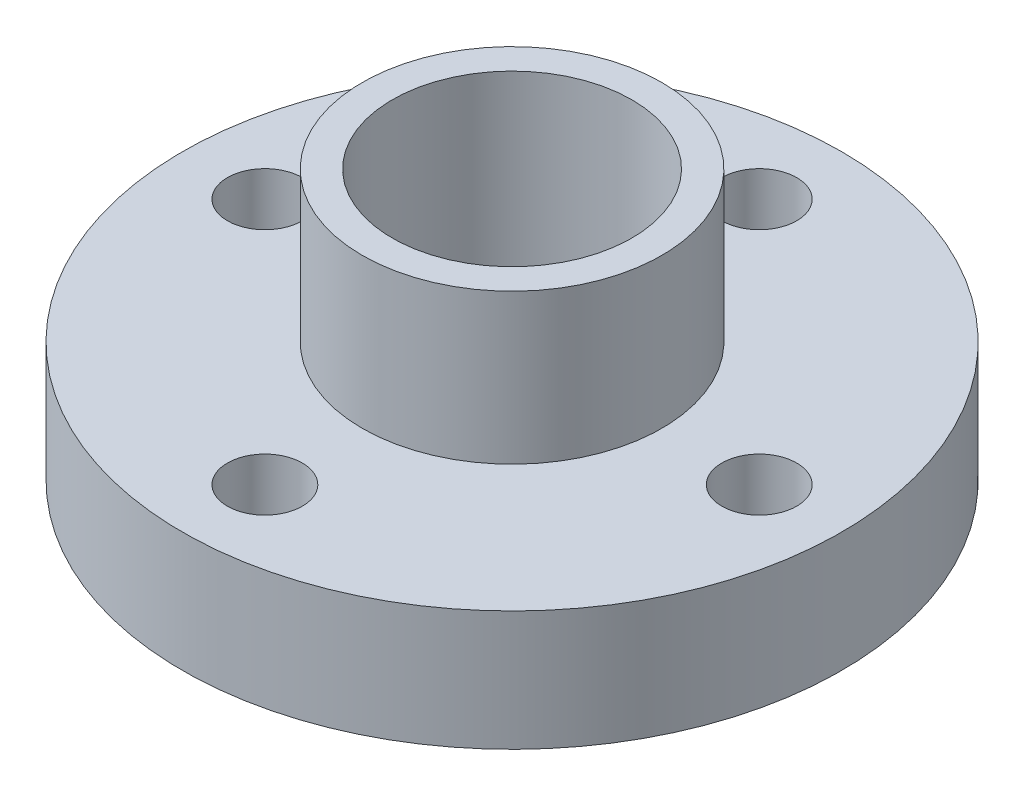
ISO-10303-21;
HEADER;
FILE_DESCRIPTION(('STEP AP214'),'2;1');
FILE_NAME('part.step','',(''),(''),'','','');
FILE_SCHEMA(('AUTOMOTIVE_DESIGN { 1 0 10303 214 1 1 1 1 }'));
ENDSEC;
DATA;
#1=APPLICATION_CONTEXT('core data for automotive mechanical design processes');
#2=APPLICATION_PROTOCOL_DEFINITION('international standard','automotive_design',2000,#1);
#3=PRODUCT_CONTEXT('',#1,'mechanical');
#4=PRODUCT('Part','Part','',(#3));
#5=PRODUCT_RELATED_PRODUCT_CATEGORY('part','',(#4));
#6=PRODUCT_DEFINITION_FORMATION('','',#4);
#7=PRODUCT_DEFINITION_CONTEXT('part definition',#1,'design');
#8=PRODUCT_DEFINITION('design','',#6,#7);
#9=PRODUCT_DEFINITION_SHAPE('','',#8);
#10=(LENGTH_UNIT() NAMED_UNIT(*) SI_UNIT(.MILLI.,.METRE.));
#11=(NAMED_UNIT(*) PLANE_ANGLE_UNIT() SI_UNIT($,.RADIAN.));
#12=(NAMED_UNIT(*) SI_UNIT($,.STERADIAN.) SOLID_ANGLE_UNIT());
#13=UNCERTAINTY_MEASURE_WITH_UNIT(LENGTH_MEASURE(1.E-05),#10,'distance_accuracy_value','');
#14=(GEOMETRIC_REPRESENTATION_CONTEXT(3) GLOBAL_UNCERTAINTY_ASSIGNED_CONTEXT((#13)) GLOBAL_UNIT_ASSIGNED_CONTEXT((#10,
#11,#12)) REPRESENTATION_CONTEXT('',''));
#15=CARTESIAN_POINT('',(0.,0.,0.));
#16=DIRECTION('',(0.,0.,1.));
#17=DIRECTION('',(1.,0.,0.));
#18=AXIS2_PLACEMENT_3D('',#15,#16,#17);
#19=CARTESIAN_POINT('',(5.,0.,0.));
#20=DIRECTION('',(0.,-1.,0.));
#21=DIRECTION('',(0.,0.,-1.));
#22=AXIS2_PLACEMENT_3D('',#19,#20,#21);
#23=PLANE('',#22);
#24=CARTESIAN_POINT('',(0.,0.,-8.25));
#25=DIRECTION('',(0.,-1.,0.));
#26=DIRECTION('',(0.,0.,-1.));
#27=AXIS2_PLACEMENT_3D('',#24,#25,#26);
#28=CIRCLE('',#27,1.25);
#29=CARTESIAN_POINT('',(0.,0.,-9.5));
#30=VERTEX_POINT('',#29);
#31=EDGE_CURVE('E80',#30,#30,#28,.T.);
#32=ORIENTED_EDGE('',*,*,#31,.F.);
#33=EDGE_LOOP('',(#32));
#34=FACE_BOUND('',#33,.T.);
#35=CARTESIAN_POINT('',(8.25,0.,0.));
#36=DIRECTION('',(0.,-1.,0.));
#37=DIRECTION('',(0.,0.,-1.));
#38=AXIS2_PLACEMENT_3D('',#35,#36,#37);
#39=CIRCLE('',#38,1.25);
#40=CARTESIAN_POINT('',(8.25,0.,-1.25));
#41=VERTEX_POINT('',#40);
#42=EDGE_CURVE('E74',#41,#41,#39,.T.);
#43=ORIENTED_EDGE('',*,*,#42,.F.);
#44=EDGE_LOOP('',(#43));
#45=FACE_BOUND('',#44,.T.);
#46=CARTESIAN_POINT('',(0.,0.,8.25));
#47=DIRECTION('',(0.,-1.,0.));
#48=DIRECTION('',(0.,0.,-1.));
#49=AXIS2_PLACEMENT_3D('',#46,#47,#48);
#50=CIRCLE('',#49,1.25);
#51=CARTESIAN_POINT('',(0.,0.,7.));
#52=VERTEX_POINT('',#51);
#53=EDGE_CURVE('E68',#52,#52,#50,.T.);
#54=ORIENTED_EDGE('',*,*,#53,.F.);
#55=EDGE_LOOP('',(#54));
#56=FACE_BOUND('',#55,.T.);
#57=CARTESIAN_POINT('',(-8.25,0.,0.));
#58=DIRECTION('',(0.,-1.,0.));
#59=DIRECTION('',(0.,0.,-1.));
#60=AXIS2_PLACEMENT_3D('',#57,#58,#59);
#61=CIRCLE('',#60,1.25);
#62=CARTESIAN_POINT('',(-8.25,0.,-1.25));
#63=VERTEX_POINT('',#62);
#64=EDGE_CURVE('E62',#63,#63,#61,.T.);
#65=ORIENTED_EDGE('',*,*,#64,.F.);
#66=EDGE_LOOP('',(#65));
#67=FACE_BOUND('',#66,.T.);
#68=CARTESIAN_POINT('',(0.,0.,0.));
#69=DIRECTION('',(0.,-1.,0.));
#70=DIRECTION('',(0.,0.,-1.));
#71=AXIS2_PLACEMENT_3D('',#68,#69,#70);
#72=CIRCLE('',#71,11.);
#73=CARTESIAN_POINT('',(0.,0.,-11.));
#74=VERTEX_POINT('',#73);
#75=EDGE_CURVE('E10',#74,#74,#72,.T.);
#76=ORIENTED_EDGE('',*,*,#75,.T.);
#77=EDGE_LOOP('',(#76));
#78=FACE_BOUND('',#77,.T.);
#79=CARTESIAN_POINT('',(0.,0.,0.));
#80=DIRECTION('',(0.,-1.,0.));
#81=DIRECTION('',(0.,0.,-1.));
#82=AXIS2_PLACEMENT_3D('',#79,#80,#81);
#83=CIRCLE('',#82,5.);
#84=CARTESIAN_POINT('',(0.,0.,-5.));
#85=VERTEX_POINT('',#84);
#86=EDGE_CURVE('E59',#85,#85,#83,.T.);
#87=ORIENTED_EDGE('',*,*,#86,.F.);
#88=EDGE_LOOP('',(#87));
#89=FACE_BOUND('',#88,.T.);
#90=ADVANCED_FACE('F31',(#34,#45,#56,#67,#78,#89),#23,.T.);
#91=CARTESIAN_POINT('',(0.,0.,0.));
#92=DIRECTION('',(0.,-1.,0.));
#93=DIRECTION('',(0.,0.,-1.));
#94=AXIS2_PLACEMENT_3D('',#91,#92,#93);
#95=CYLINDRICAL_SURFACE('',#94,11.);
#96=CARTESIAN_POINT('',(0.,4.,0.));
#97=DIRECTION('',(0.,-1.,0.));
#98=DIRECTION('',(0.,0.,-1.));
#99=AXIS2_PLACEMENT_3D('',#96,#97,#98);
#100=CIRCLE('',#99,11.);
#101=CARTESIAN_POINT('',(0.,4.,-11.));
#102=VERTEX_POINT('',#101);
#103=EDGE_CURVE('E37',#102,#102,#100,.T.);
#104=ORIENTED_EDGE('',*,*,#103,.T.);
#105=EDGE_LOOP('',(#104));
#106=FACE_BOUND('',#105,.T.);
#107=ORIENTED_EDGE('',*,*,#75,.F.);
#108=EDGE_LOOP('',(#107));
#109=FACE_BOUND('',#108,.T.);
#110=ADVANCED_FACE('F93',(#106,#109),#95,.T.);
#111=CARTESIAN_POINT('',(11.,4.,0.));
#112=DIRECTION('',(0.,1.,0.));
#113=DIRECTION('',(0.,0.,1.));
#114=AXIS2_PLACEMENT_3D('',#111,#112,#113);
#115=PLANE('',#114);
#116=CARTESIAN_POINT('',(0.,4.,-8.25));
#117=DIRECTION('',(0.,1.,0.));
#118=DIRECTION('',(0.,0.,1.));
#119=AXIS2_PLACEMENT_3D('',#116,#117,#118);
#120=CIRCLE('',#119,1.25);
#121=CARTESIAN_POINT('',(0.,4.,-7.));
#122=VERTEX_POINT('',#121);
#123=EDGE_CURVE('E83',#122,#122,#120,.T.);
#124=ORIENTED_EDGE('',*,*,#123,.F.);
#125=EDGE_LOOP('',(#124));
#126=FACE_BOUND('',#125,.T.);
#127=CARTESIAN_POINT('',(8.25,4.,0.));
#128=DIRECTION('',(0.,1.,0.));
#129=DIRECTION('',(0.,0.,1.));
#130=AXIS2_PLACEMENT_3D('',#127,#128,#129);
#131=CIRCLE('',#130,1.25);
#132=CARTESIAN_POINT('',(8.25,4.,1.25));
#133=VERTEX_POINT('',#132);
#134=EDGE_CURVE('E77',#133,#133,#131,.T.);
#135=ORIENTED_EDGE('',*,*,#134,.F.);
#136=EDGE_LOOP('',(#135));
#137=FACE_BOUND('',#136,.T.);
#138=CARTESIAN_POINT('',(0.,4.,8.25));
#139=DIRECTION('',(0.,1.,0.));
#140=DIRECTION('',(0.,0.,1.));
#141=AXIS2_PLACEMENT_3D('',#138,#139,#140);
#142=CIRCLE('',#141,1.25);
#143=CARTESIAN_POINT('',(0.,4.,9.5));
#144=VERTEX_POINT('',#143);
#145=EDGE_CURVE('E71',#144,#144,#142,.T.);
#146=ORIENTED_EDGE('',*,*,#145,.F.);
#147=EDGE_LOOP('',(#146));
#148=FACE_BOUND('',#147,.T.);
#149=CARTESIAN_POINT('',(-8.25,4.,0.));
#150=DIRECTION('',(0.,1.,0.));
#151=DIRECTION('',(0.,0.,1.));
#152=AXIS2_PLACEMENT_3D('',#149,#150,#151);
#153=CIRCLE('',#152,1.25);
#154=CARTESIAN_POINT('',(-8.25,4.,1.25));
#155=VERTEX_POINT('',#154);
#156=EDGE_CURVE('E65',#155,#155,#153,.T.);
#157=ORIENTED_EDGE('',*,*,#156,.F.);
#158=EDGE_LOOP('',(#157));
#159=FACE_BOUND('',#158,.T.);
#160=CARTESIAN_POINT('',(0.,4.,0.));
#161=DIRECTION('',(0.,-1.,0.));
#162=DIRECTION('',(0.,0.,-1.));
#163=AXIS2_PLACEMENT_3D('',#160,#161,#162);
#164=CIRCLE('',#163,5.);
#165=CARTESIAN_POINT('',(0.,4.,-5.));
#166=VERTEX_POINT('',#165);
#167=EDGE_CURVE('E41',#166,#166,#164,.T.);
#168=ORIENTED_EDGE('',*,*,#167,.T.);
#169=EDGE_LOOP('',(#168));
#170=FACE_BOUND('',#169,.T.);
#171=ORIENTED_EDGE('',*,*,#103,.F.);
#172=EDGE_LOOP('',(#171));
#173=FACE_BOUND('',#172,.T.);
#174=ADVANCED_FACE('F89',(#126,#137,#148,#159,#170,#173),#115,.T.);
#175=CARTESIAN_POINT('',(0.,0.,0.));
#176=DIRECTION('',(0.,-1.,0.));
#177=DIRECTION('',(0.,0.,-1.));
#178=AXIS2_PLACEMENT_3D('',#175,#176,#177);
#179=CYLINDRICAL_SURFACE('',#178,5.);
#180=CARTESIAN_POINT('',(0.,9.,0.));
#181=DIRECTION('',(0.,-1.,0.));
#182=DIRECTION('',(0.,0.,-1.));
#183=AXIS2_PLACEMENT_3D('',#180,#181,#182);
#184=CIRCLE('',#183,5.);
#185=CARTESIAN_POINT('',(0.,9.,-5.));
#186=VERTEX_POINT('',#185);
#187=EDGE_CURVE('E45',#186,#186,#184,.T.);
#188=ORIENTED_EDGE('',*,*,#187,.T.);
#189=EDGE_LOOP('',(#188));
#190=FACE_BOUND('',#189,.T.);
#191=ORIENTED_EDGE('',*,*,#167,.F.);
#192=EDGE_LOOP('',(#191));
#193=FACE_BOUND('',#192,.T.);
#194=ADVANCED_FACE('F92',(#190,#193),#179,.T.);
#195=CARTESIAN_POINT('',(5.,9.,0.));
#196=DIRECTION('',(0.,1.,0.));
#197=DIRECTION('',(0.,0.,1.));
#198=AXIS2_PLACEMENT_3D('',#195,#196,#197);
#199=PLANE('',#198);
#200=CARTESIAN_POINT('',(0.,9.,0.));
#201=DIRECTION('',(0.,-1.,0.));
#202=DIRECTION('',(0.,0.,-1.));
#203=AXIS2_PLACEMENT_3D('',#200,#201,#202);
#204=CIRCLE('',#203,4.);
#205=CARTESIAN_POINT('',(0.,9.,-4.));
#206=VERTEX_POINT('',#205);
#207=EDGE_CURVE('E50',#206,#206,#204,.T.);
#208=ORIENTED_EDGE('',*,*,#207,.T.);
#209=EDGE_LOOP('',(#208));
#210=FACE_BOUND('',#209,.T.);
#211=ORIENTED_EDGE('',*,*,#187,.F.);
#212=EDGE_LOOP('',(#211));
#213=FACE_BOUND('',#212,.T.);
#214=ADVANCED_FACE('F105',(#210,#213),#199,.T.);
#215=CARTESIAN_POINT('',(0.,0.,0.));
#216=DIRECTION('',(0.,-1.,0.));
#217=DIRECTION('',(0.,0.,-1.));
#218=AXIS2_PLACEMENT_3D('',#215,#216,#217);
#219=CYLINDRICAL_SURFACE('',#218,4.);
#220=CARTESIAN_POINT('',(0.,-2.,0.));
#221=DIRECTION('',(0.,-1.,0.));
#222=DIRECTION('',(0.,0.,-1.));
#223=AXIS2_PLACEMENT_3D('',#220,#221,#222);
#224=CIRCLE('',#223,4.);
#225=CARTESIAN_POINT('',(0.,-2.,-4.));
#226=VERTEX_POINT('',#225);
#227=EDGE_CURVE('E53',#226,#226,#224,.T.);
#228=ORIENTED_EDGE('',*,*,#227,.T.);
#229=EDGE_LOOP('',(#228));
#230=FACE_BOUND('',#229,.T.);
#231=ORIENTED_EDGE('',*,*,#207,.F.);
#232=EDGE_LOOP('',(#231));
#233=FACE_BOUND('',#232,.T.);
#234=ADVANCED_FACE('F111',(#230,#233),#219,.F.);
#235=CARTESIAN_POINT('',(4.,-2.,0.));
#236=DIRECTION('',(0.,-1.,0.));
#237=DIRECTION('',(0.,0.,-1.));
#238=AXIS2_PLACEMENT_3D('',#235,#236,#237);
#239=PLANE('',#238);
#240=CARTESIAN_POINT('',(0.,-2.,0.));
#241=DIRECTION('',(0.,-1.,0.));
#242=DIRECTION('',(0.,0.,-1.));
#243=AXIS2_PLACEMENT_3D('',#240,#241,#242);
#244=CIRCLE('',#243,5.);
#245=CARTESIAN_POINT('',(0.,-2.,-5.));
#246=VERTEX_POINT('',#245);
#247=EDGE_CURVE('E56',#246,#246,#244,.T.);
#248=ORIENTED_EDGE('',*,*,#247,.T.);
#249=EDGE_LOOP('',(#248));
#250=FACE_BOUND('',#249,.T.);
#251=ORIENTED_EDGE('',*,*,#227,.F.);
#252=EDGE_LOOP('',(#251));
#253=FACE_BOUND('',#252,.T.);
#254=ADVANCED_FACE('F133',(#250,#253),#239,.T.);
#255=CARTESIAN_POINT('',(0.,0.,0.));
#256=DIRECTION('',(0.,-1.,0.));
#257=DIRECTION('',(0.,0.,-1.));
#258=AXIS2_PLACEMENT_3D('',#255,#256,#257);
#259=CYLINDRICAL_SURFACE('',#258,5.);
#260=ORIENTED_EDGE('',*,*,#86,.T.);
#261=EDGE_LOOP('',(#260));
#262=FACE_BOUND('',#261,.T.);
#263=ORIENTED_EDGE('',*,*,#247,.F.);
#264=EDGE_LOOP('',(#263));
#265=FACE_BOUND('',#264,.T.);
#266=ADVANCED_FACE('F129',(#262,#265),#259,.T.);
#267=CARTESIAN_POINT('',(-8.25,4.,0.));
#268=DIRECTION('',(0.,1.,0.));
#269=DIRECTION('',(0.,0.,1.));
#270=AXIS2_PLACEMENT_3D('',#267,#268,#269);
#271=CYLINDRICAL_SURFACE('',#270,1.25);
#272=ORIENTED_EDGE('',*,*,#64,.T.);
#273=EDGE_LOOP('',(#272));
#274=FACE_BOUND('',#273,.T.);
#275=ORIENTED_EDGE('',*,*,#156,.T.);
#276=EDGE_LOOP('',(#275));
#277=FACE_BOUND('',#276,.T.);
#278=ADVANCED_FACE('F132',(#274,#277),#271,.F.);
#279=CARTESIAN_POINT('',(0.,4.,8.25));
#280=DIRECTION('',(0.,1.,0.));
#281=DIRECTION('',(0.,0.,1.));
#282=AXIS2_PLACEMENT_3D('',#279,#280,#281);
#283=CYLINDRICAL_SURFACE('',#282,1.25);
#284=ORIENTED_EDGE('',*,*,#53,.T.);
#285=EDGE_LOOP('',(#284));
#286=FACE_BOUND('',#285,.T.);
#287=ORIENTED_EDGE('',*,*,#145,.T.);
#288=EDGE_LOOP('',(#287));
#289=FACE_BOUND('',#288,.T.);
#290=ADVANCED_FACE('F153',(#286,#289),#283,.F.);
#291=CARTESIAN_POINT('',(8.25,4.,0.));
#292=DIRECTION('',(0.,1.,0.));
#293=DIRECTION('',(0.,0.,1.));
#294=AXIS2_PLACEMENT_3D('',#291,#292,#293);
#295=CYLINDRICAL_SURFACE('',#294,1.25);
#296=ORIENTED_EDGE('',*,*,#42,.T.);
#297=EDGE_LOOP('',(#296));
#298=FACE_BOUND('',#297,.T.);
#299=ORIENTED_EDGE('',*,*,#134,.T.);
#300=EDGE_LOOP('',(#299));
#301=FACE_BOUND('',#300,.T.);
#302=ADVANCED_FACE('F157',(#298,#301),#295,.F.);
#303=CARTESIAN_POINT('',(0.,4.,-8.25));
#304=DIRECTION('',(0.,1.,0.));
#305=DIRECTION('',(0.,0.,1.));
#306=AXIS2_PLACEMENT_3D('',#303,#304,#305);
#307=CYLINDRICAL_SURFACE('',#306,1.25);
#308=ORIENTED_EDGE('',*,*,#31,.T.);
#309=EDGE_LOOP('',(#308));
#310=FACE_BOUND('',#309,.T.);
#311=ORIENTED_EDGE('',*,*,#123,.T.);
#312=EDGE_LOOP('',(#311));
#313=FACE_BOUND('',#312,.T.);
#314=ADVANCED_FACE('F87',(#310,#313),#307,.F.);
#315=CLOSED_SHELL('',(#90,#110,#174,#194,#214,#234,#254,#266,#278,#290,#302,#314));
#316=MANIFOLD_SOLID_BREP('B2',#315);
#317=ADVANCED_BREP_SHAPE_REPRESENTATION('',(#18,#316),#14);
#318=SHAPE_DEFINITION_REPRESENTATION(#9,#317);
ENDSEC;
END-ISO-10303-21;
